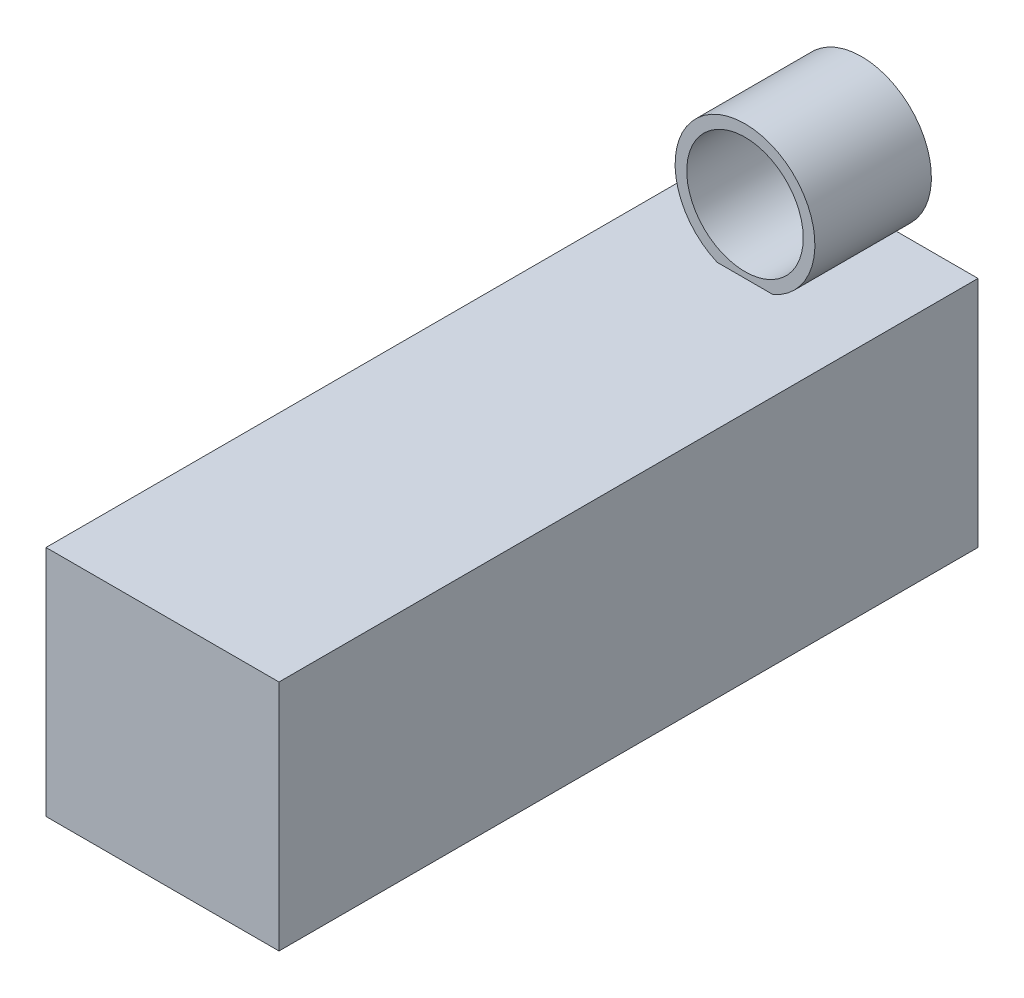
ISO-10303-21;
HEADER;
FILE_DESCRIPTION(('STEP AP214'),'2;1');
FILE_NAME('part.step','',(''),(''),'','','');
FILE_SCHEMA(('AUTOMOTIVE_DESIGN { 1 0 10303 214 1 1 1 1 }'));
ENDSEC;
DATA;
#1=APPLICATION_CONTEXT('core data for automotive mechanical design processes');
#2=APPLICATION_PROTOCOL_DEFINITION('international standard','automotive_design',2000,#1);
#3=PRODUCT_CONTEXT('',#1,'mechanical');
#4=PRODUCT('Part','Part','',(#3));
#5=PRODUCT_RELATED_PRODUCT_CATEGORY('part','',(#4));
#6=PRODUCT_DEFINITION_FORMATION('','',#4);
#7=PRODUCT_DEFINITION_CONTEXT('part definition',#1,'design');
#8=PRODUCT_DEFINITION('design','',#6,#7);
#9=PRODUCT_DEFINITION_SHAPE('','',#8);
#10=(LENGTH_UNIT() NAMED_UNIT(*) SI_UNIT(.MILLI.,.METRE.));
#11=(NAMED_UNIT(*) PLANE_ANGLE_UNIT() SI_UNIT($,.RADIAN.));
#12=(NAMED_UNIT(*) SI_UNIT($,.STERADIAN.) SOLID_ANGLE_UNIT());
#13=UNCERTAINTY_MEASURE_WITH_UNIT(LENGTH_MEASURE(1.E-05),#10,'distance_accuracy_value','');
#14=(GEOMETRIC_REPRESENTATION_CONTEXT(3) GLOBAL_UNCERTAINTY_ASSIGNED_CONTEXT((#13)) GLOBAL_UNIT_ASSIGNED_CONTEXT((#10,
#11,#12)) REPRESENTATION_CONTEXT('',''));
#15=CARTESIAN_POINT('',(0.,0.,0.));
#16=DIRECTION('',(0.,0.,1.));
#17=DIRECTION('',(1.,0.,0.));
#18=AXIS2_PLACEMENT_3D('',#15,#16,#17);
#19=CARTESIAN_POINT('',(0.,0.,60.));
#20=DIRECTION('',(0.,-1.,0.));
#21=DIRECTION('',(0.,0.,-1.));
#22=AXIS2_PLACEMENT_3D('',#19,#20,#21);
#23=PLANE('',#22);
#24=DIRECTION('',(0.,0.,-1.));
#25=VECTOR('',#24,1.);
#26=CARTESIAN_POINT('',(7.60208423834363,0.,10.));
#27=LINE('',#26,#25);
#28=CARTESIAN_POINT('',(7.60208423834363,0.,0.));
#29=VERTEX_POINT('',#28);
#30=CARTESIAN_POINT('',(7.60208423834363,0.,10.));
#31=VERTEX_POINT('',#30);
#32=EDGE_CURVE('E113',#29,#31,#27,.F.);
#33=ORIENTED_EDGE('',*,*,#32,.F.);
#34=DIRECTION('',(-1.,0.,0.));
#35=VECTOR('',#34,1.);
#36=CARTESIAN_POINT('',(0.,0.,0.));
#37=LINE('',#36,#35);
#38=CARTESIAN_POINT('',(0.,0.,0.));
#39=VERTEX_POINT('',#38);
#40=EDGE_CURVE('E103',#29,#39,#37,.T.);
#41=ORIENTED_EDGE('',*,*,#40,.T.);
#42=DIRECTION('',(0.,0.,-1.));
#43=VECTOR('',#42,1.);
#44=CARTESIAN_POINT('',(0.,0.,60.));
#45=LINE('',#44,#43);
#46=CARTESIAN_POINT('',(0.,0.,60.));
#47=VERTEX_POINT('',#46);
#48=EDGE_CURVE('E153',#47,#39,#45,.T.);
#49=ORIENTED_EDGE('',*,*,#48,.F.);
#50=DIRECTION('',(-1.,0.,0.));
#51=VECTOR('',#50,1.);
#52=CARTESIAN_POINT('',(0.,0.,60.));
#53=LINE('',#52,#51);
#54=CARTESIAN_POINT('',(20.,0.,60.));
#55=VERTEX_POINT('',#54);
#56=EDGE_CURVE('E150',#55,#47,#53,.T.);
#57=ORIENTED_EDGE('',*,*,#56,.F.);
#58=DIRECTION('',(0.,0.,-1.));
#59=VECTOR('',#58,1.);
#60=CARTESIAN_POINT('',(20.,0.,60.));
#61=LINE('',#60,#59);
#62=CARTESIAN_POINT('',(20.,0.,0.));
#63=VERTEX_POINT('',#62);
#64=EDGE_CURVE('E97',#55,#63,#61,.T.);
#65=ORIENTED_EDGE('',*,*,#64,.T.);
#66=CARTESIAN_POINT('',(12.3979157616564,0.,0.));
#67=VERTEX_POINT('',#66);
#68=EDGE_CURVE('E94',#63,#67,#37,.T.);
#69=ORIENTED_EDGE('',*,*,#68,.T.);
#70=DIRECTION('',(0.,0.,-1.));
#71=VECTOR('',#70,1.);
#72=CARTESIAN_POINT('',(12.3979157616564,0.,10.));
#73=LINE('',#72,#71);
#74=CARTESIAN_POINT('',(12.3979157616564,0.,10.));
#75=VERTEX_POINT('',#74);
#76=EDGE_CURVE('E64',#75,#67,#73,.T.);
#77=ORIENTED_EDGE('',*,*,#76,.F.);
#78=DIRECTION('',(-1.,0.,0.));
#79=VECTOR('',#78,1.);
#80=CARTESIAN_POINT('',(0.,0.,10.));
#81=LINE('',#80,#79);
#82=EDGE_CURVE('E11',#75,#31,#81,.T.);
#83=ORIENTED_EDGE('',*,*,#82,.T.);
#84=EDGE_LOOP('',(#33,#41,#49,#57,#65,#69,#77,#83));
#85=FACE_BOUND('',#84,.T.);
#86=ADVANCED_FACE('F45',(#85),#23,.F.);
#87=CARTESIAN_POINT('',(0.,0.,60.));
#88=DIRECTION('',(1.,0.,0.));
#89=DIRECTION('',(0.,1.,0.));
#90=AXIS2_PLACEMENT_3D('',#87,#88,#89);
#91=PLANE('',#90);
#92=DIRECTION('',(0.,-1.,0.));
#93=VECTOR('',#92,1.);
#94=CARTESIAN_POINT('',(0.,0.,0.));
#95=LINE('',#94,#93);
#96=CARTESIAN_POINT('',(0.,-20.,0.));
#97=VERTEX_POINT('',#96);
#98=EDGE_CURVE('E137',#39,#97,#95,.T.);
#99=ORIENTED_EDGE('',*,*,#98,.T.);
#100=DIRECTION('',(0.,0.,-1.));
#101=VECTOR('',#100,1.);
#102=CARTESIAN_POINT('',(0.,-20.,60.));
#103=LINE('',#102,#101);
#104=CARTESIAN_POINT('',(0.,-20.,60.));
#105=VERTEX_POINT('',#104);
#106=EDGE_CURVE('E54',#105,#97,#103,.T.);
#107=ORIENTED_EDGE('',*,*,#106,.F.);
#108=DIRECTION('',(0.,-1.,0.));
#109=VECTOR('',#108,1.);
#110=CARTESIAN_POINT('',(0.,0.,60.));
#111=LINE('',#110,#109);
#112=EDGE_CURVE('E102',#47,#105,#111,.T.);
#113=ORIENTED_EDGE('',*,*,#112,.F.);
#114=ORIENTED_EDGE('',*,*,#48,.T.);
#115=EDGE_LOOP('',(#99,#107,#113,#114));
#116=FACE_BOUND('',#115,.T.);
#117=ADVANCED_FACE('F47',(#116),#91,.F.);
#118=CARTESIAN_POINT('',(0.,-20.,60.));
#119=DIRECTION('',(0.,1.,0.));
#120=DIRECTION('',(0.,0.,1.));
#121=AXIS2_PLACEMENT_3D('',#118,#119,#120);
#122=PLANE('',#121);
#123=CARTESIAN_POINT('',(10.,-20.,30.));
#124=DIRECTION('',(0.,-1.,0.));
#125=DIRECTION('',(0.,0.,-1.));
#126=AXIS2_PLACEMENT_3D('',#123,#124,#125);
#127=CIRCLE('',#126,2.6);
#128=CARTESIAN_POINT('',(10.,-20.,27.4));
#129=VERTEX_POINT('',#128);
#130=EDGE_CURVE('E132',#129,#129,#127,.T.);
#131=ORIENTED_EDGE('',*,*,#130,.F.);
#132=EDGE_LOOP('',(#131));
#133=FACE_BOUND('',#132,.T.);
#134=DIRECTION('',(1.,0.,0.));
#135=VECTOR('',#134,1.);
#136=CARTESIAN_POINT('',(0.,-20.,0.));
#137=LINE('',#136,#135);
#138=CARTESIAN_POINT('',(20.,-20.,0.));
#139=VERTEX_POINT('',#138);
#140=EDGE_CURVE('E157',#97,#139,#137,.T.);
#141=ORIENTED_EDGE('',*,*,#140,.T.);
#142=DIRECTION('',(0.,0.,-1.));
#143=VECTOR('',#142,1.);
#144=CARTESIAN_POINT('',(20.,-20.,60.));
#145=LINE('',#144,#143);
#146=CARTESIAN_POINT('',(20.,-20.,60.));
#147=VERTEX_POINT('',#146);
#148=EDGE_CURVE('E168',#147,#139,#145,.T.);
#149=ORIENTED_EDGE('',*,*,#148,.F.);
#150=DIRECTION('',(1.,0.,0.));
#151=VECTOR('',#150,1.);
#152=CARTESIAN_POINT('',(0.,-20.,60.));
#153=LINE('',#152,#151);
#154=EDGE_CURVE('E144',#105,#147,#153,.T.);
#155=ORIENTED_EDGE('',*,*,#154,.F.);
#156=ORIENTED_EDGE('',*,*,#106,.T.);
#157=EDGE_LOOP('',(#141,#149,#155,#156));
#158=FACE_BOUND('',#157,.T.);
#159=ADVANCED_FACE('F175',(#133,#158),#122,.F.);
#160=CARTESIAN_POINT('',(20.,0.,60.));
#161=DIRECTION('',(-1.,0.,0.));
#162=DIRECTION('',(0.,-1.,0.));
#163=AXIS2_PLACEMENT_3D('',#160,#161,#162);
#164=PLANE('',#163);
#165=DIRECTION('',(0.,1.,0.));
#166=VECTOR('',#165,1.);
#167=CARTESIAN_POINT('',(20.,0.,0.));
#168=LINE('',#167,#166);
#169=EDGE_CURVE('E160',#139,#63,#168,.T.);
#170=ORIENTED_EDGE('',*,*,#169,.T.);
#171=ORIENTED_EDGE('',*,*,#64,.F.);
#172=DIRECTION('',(0.,1.,0.));
#173=VECTOR('',#172,1.);
#174=CARTESIAN_POINT('',(20.,0.,60.));
#175=LINE('',#174,#173);
#176=EDGE_CURVE('E147',#147,#55,#175,.T.);
#177=ORIENTED_EDGE('',*,*,#176,.F.);
#178=ORIENTED_EDGE('',*,*,#148,.T.);
#179=EDGE_LOOP('',(#170,#171,#177,#178));
#180=FACE_BOUND('',#179,.T.);
#181=ADVANCED_FACE('F181',(#180),#164,.F.);
#182=CARTESIAN_POINT('',(0.,0.,60.));
#183=DIRECTION('',(0.,0.,1.));
#184=DIRECTION('',(1.,0.,0.));
#185=AXIS2_PLACEMENT_3D('',#182,#183,#184);
#186=PLANE('',#185);
#187=ORIENTED_EDGE('',*,*,#112,.T.);
#188=ORIENTED_EDGE('',*,*,#154,.T.);
#189=ORIENTED_EDGE('',*,*,#176,.T.);
#190=ORIENTED_EDGE('',*,*,#56,.T.);
#191=EDGE_LOOP('',(#187,#188,#189,#190));
#192=FACE_BOUND('',#191,.T.);
#193=ADVANCED_FACE('F184',(#192),#186,.T.);
#194=CARTESIAN_POINT('',(0.,0.,0.));
#195=DIRECTION('',(0.,0.,1.));
#196=DIRECTION('',(1.,0.,0.));
#197=AXIS2_PLACEMENT_3D('',#194,#195,#196);
#198=PLANE('',#197);
#199=ORIENTED_EDGE('',*,*,#40,.F.);
#200=CARTESIAN_POINT('',(10.,5.5,0.));
#201=DIRECTION('',(0.,0.,1.));
#202=DIRECTION('',(1.,0.,0.));
#203=AXIS2_PLACEMENT_3D('',#200,#201,#202);
#204=CIRCLE('',#203,6.);
#205=EDGE_CURVE('E109',#67,#29,#204,.T.);
#206=ORIENTED_EDGE('',*,*,#205,.F.);
#207=ORIENTED_EDGE('',*,*,#68,.F.);
#208=ORIENTED_EDGE('',*,*,#169,.F.);
#209=ORIENTED_EDGE('',*,*,#140,.F.);
#210=ORIENTED_EDGE('',*,*,#98,.F.);
#211=EDGE_LOOP('',(#199,#206,#207,#208,#209,#210));
#212=FACE_BOUND('',#211,.T.);
#213=CARTESIAN_POINT('',(10.,5.5,0.));
#214=DIRECTION('',(0.,0.,1.));
#215=DIRECTION('',(1.,0.,0.));
#216=AXIS2_PLACEMENT_3D('',#213,#214,#215);
#217=CIRCLE('',#216,5.);
#218=CARTESIAN_POINT('',(15.,5.5,0.));
#219=VERTEX_POINT('',#218);
#220=EDGE_CURVE('E126',#219,#219,#217,.T.);
#221=ORIENTED_EDGE('',*,*,#220,.T.);
#222=EDGE_LOOP('',(#221));
#223=FACE_BOUND('',#222,.T.);
#224=ADVANCED_FACE('F116',(#212,#223),#198,.F.);
#225=CARTESIAN_POINT('',(10.,-15.,30.));
#226=DIRECTION('',(0.,-1.,0.));
#227=DIRECTION('',(0.,0.,-1.));
#228=AXIS2_PLACEMENT_3D('',#225,#226,#227);
#229=CYLINDRICAL_SURFACE('',#228,2.6);
#230=CARTESIAN_POINT('',(10.,-15.,30.));
#231=DIRECTION('',(0.,-1.,0.));
#232=DIRECTION('',(0.,0.,-1.));
#233=AXIS2_PLACEMENT_3D('',#230,#231,#232);
#234=CIRCLE('',#233,2.6);
#235=CARTESIAN_POINT('',(10.,-15.,27.4));
#236=VERTEX_POINT('',#235);
#237=EDGE_CURVE('E133',#236,#236,#234,.T.);
#238=ORIENTED_EDGE('',*,*,#237,.F.);
#239=EDGE_LOOP('',(#238));
#240=FACE_BOUND('',#239,.T.);
#241=ORIENTED_EDGE('',*,*,#130,.T.);
#242=EDGE_LOOP('',(#241));
#243=FACE_BOUND('',#242,.T.);
#244=ADVANCED_FACE('F199',(#240,#243),#229,.F.);
#245=CARTESIAN_POINT('',(10.,-15.,30.));
#246=DIRECTION('',(0.,-1.,0.));
#247=DIRECTION('',(0.,0.,-1.));
#248=AXIS2_PLACEMENT_3D('',#245,#246,#247);
#249=PLANE('',#248);
#250=ORIENTED_EDGE('',*,*,#237,.T.);
#251=EDGE_LOOP('',(#250));
#252=FACE_BOUND('',#251,.T.);
#253=ADVANCED_FACE('F189',(#252),#249,.T.);
#254=CARTESIAN_POINT('',(10.,5.5,10.));
#255=DIRECTION('',(0.,0.,1.));
#256=DIRECTION('',(1.,0.,0.));
#257=AXIS2_PLACEMENT_3D('',#254,#255,#256);
#258=PLANE('',#257);
#259=CARTESIAN_POINT('',(10.,5.5,10.));
#260=DIRECTION('',(0.,0.,1.));
#261=DIRECTION('',(1.,0.,0.));
#262=AXIS2_PLACEMENT_3D('',#259,#260,#261);
#263=CIRCLE('',#262,5.);
#264=CARTESIAN_POINT('',(15.,5.5,10.));
#265=VERTEX_POINT('',#264);
#266=EDGE_CURVE('E120',#265,#265,#263,.T.);
#267=ORIENTED_EDGE('',*,*,#266,.F.);
#268=EDGE_LOOP('',(#267));
#269=FACE_BOUND('',#268,.T.);
#270=ORIENTED_EDGE('',*,*,#82,.F.);
#271=CARTESIAN_POINT('',(10.,5.5,10.));
#272=DIRECTION('',(0.,0.,1.));
#273=DIRECTION('',(1.,0.,0.));
#274=AXIS2_PLACEMENT_3D('',#271,#272,#273);
#275=CIRCLE('',#274,6.);
#276=EDGE_CURVE('E111',#75,#31,#275,.T.);
#277=ORIENTED_EDGE('',*,*,#276,.T.);
#278=EDGE_LOOP('',(#270,#277));
#279=FACE_BOUND('',#278,.T.);
#280=ADVANCED_FACE('F187',(#269,#279),#258,.T.);
#281=CARTESIAN_POINT('',(10.,5.5,10.));
#282=DIRECTION('',(0.,0.,-1.));
#283=DIRECTION('',(-1.,0.,0.));
#284=AXIS2_PLACEMENT_3D('',#281,#282,#283);
#285=CYLINDRICAL_SURFACE('',#284,6.);
#286=ORIENTED_EDGE('',*,*,#205,.T.);
#287=ORIENTED_EDGE('',*,*,#32,.T.);
#288=ORIENTED_EDGE('',*,*,#276,.F.);
#289=ORIENTED_EDGE('',*,*,#76,.T.);
#290=EDGE_LOOP('',(#286,#287,#288,#289));
#291=FACE_BOUND('',#290,.T.);
#292=ADVANCED_FACE('F108',(#291),#285,.T.);
#293=CARTESIAN_POINT('',(10.,5.5,10.));
#294=DIRECTION('',(0.,0.,-1.));
#295=DIRECTION('',(-1.,0.,0.));
#296=AXIS2_PLACEMENT_3D('',#293,#294,#295);
#297=CYLINDRICAL_SURFACE('',#296,5.);
#298=ORIENTED_EDGE('',*,*,#266,.T.);
#299=EDGE_LOOP('',(#298));
#300=FACE_BOUND('',#299,.T.);
#301=ORIENTED_EDGE('',*,*,#220,.F.);
#302=EDGE_LOOP('',(#301));
#303=FACE_BOUND('',#302,.T.);
#304=ADVANCED_FACE('F196',(#300,#303),#297,.F.);
#305=CLOSED_SHELL('',(#86,#117,#159,#181,#193,#224,#244,#253,#280,#292,#304));
#306=MANIFOLD_SOLID_BREP('B2',#305);
#307=ADVANCED_BREP_SHAPE_REPRESENTATION('',(#18,#306),#14);
#308=SHAPE_DEFINITION_REPRESENTATION(#9,#307);
ENDSEC;
END-ISO-10303-21;
